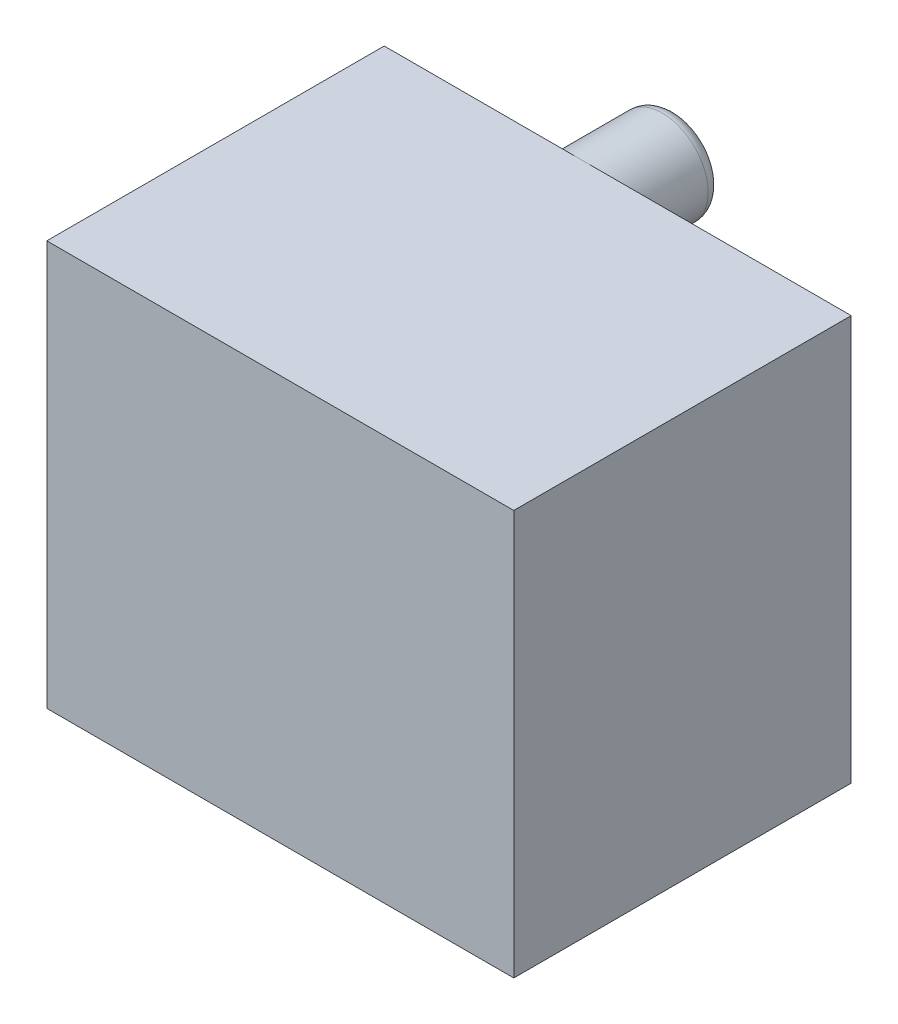
ISO-10303-21;
HEADER;
FILE_DESCRIPTION(('STEP AP214'),'2;1');
FILE_NAME('part.step','',(''),(''),'','','');
FILE_SCHEMA(('AUTOMOTIVE_DESIGN { 1 0 10303 214 1 1 1 1 }'));
ENDSEC;
DATA;
#1=APPLICATION_CONTEXT('core data for automotive mechanical design processes');
#2=APPLICATION_PROTOCOL_DEFINITION('international standard','automotive_design',2000,#1);
#3=PRODUCT_CONTEXT('',#1,'mechanical');
#4=PRODUCT('Part','Part','',(#3));
#5=PRODUCT_RELATED_PRODUCT_CATEGORY('part','',(#4));
#6=PRODUCT_DEFINITION_FORMATION('','',#4);
#7=PRODUCT_DEFINITION_CONTEXT('part definition',#1,'design');
#8=PRODUCT_DEFINITION('design','',#6,#7);
#9=PRODUCT_DEFINITION_SHAPE('','',#8);
#10=(LENGTH_UNIT() NAMED_UNIT(*) SI_UNIT(.MILLI.,.METRE.));
#11=(NAMED_UNIT(*) PLANE_ANGLE_UNIT() SI_UNIT($,.RADIAN.));
#12=(NAMED_UNIT(*) SI_UNIT($,.STERADIAN.) SOLID_ANGLE_UNIT());
#13=UNCERTAINTY_MEASURE_WITH_UNIT(LENGTH_MEASURE(1.E-05),#10,'distance_accuracy_value','');
#14=(GEOMETRIC_REPRESENTATION_CONTEXT(3) GLOBAL_UNCERTAINTY_ASSIGNED_CONTEXT((#13)) GLOBAL_UNIT_ASSIGNED_CONTEXT((#10,
#11,#12)) REPRESENTATION_CONTEXT('',''));
#15=CARTESIAN_POINT('',(0.,0.,0.));
#16=DIRECTION('',(0.,0.,1.));
#17=DIRECTION('',(1.,0.,0.));
#18=AXIS2_PLACEMENT_3D('',#15,#16,#17);
#19=CARTESIAN_POINT('',(8.65,7.5,12.5));
#20=DIRECTION('',(-1.,0.,0.));
#21=DIRECTION('',(0.,-1.,0.));
#22=AXIS2_PLACEMENT_3D('',#19,#20,#21);
#23=PLANE('',#22);
#24=DIRECTION('',(0.,1.,0.));
#25=VECTOR('',#24,1.);
#26=CARTESIAN_POINT('',(8.65,7.5,0.));
#27=LINE('',#26,#25);
#28=CARTESIAN_POINT('',(8.65,-7.5,0.));
#29=VERTEX_POINT('',#28);
#30=CARTESIAN_POINT('',(8.65,7.5,0.));
#31=VERTEX_POINT('',#30);
#32=EDGE_CURVE('E224',#29,#31,#27,.T.);
#33=ORIENTED_EDGE('',*,*,#32,.T.);
#34=DIRECTION('',(0.,0.,-1.));
#35=VECTOR('',#34,1.);
#36=CARTESIAN_POINT('',(8.65,7.5,12.5));
#37=LINE('',#36,#35);
#38=CARTESIAN_POINT('',(8.65,7.5,12.5));
#39=VERTEX_POINT('',#38);
#40=EDGE_CURVE('E236',#39,#31,#37,.T.);
#41=ORIENTED_EDGE('',*,*,#40,.F.);
#42=DIRECTION('',(0.,1.,0.));
#43=VECTOR('',#42,1.);
#44=CARTESIAN_POINT('',(8.65,7.5,12.5));
#45=LINE('',#44,#43);
#46=CARTESIAN_POINT('',(8.65,-7.5,12.5));
#47=VERTEX_POINT('',#46);
#48=EDGE_CURVE('E217',#47,#39,#45,.T.);
#49=ORIENTED_EDGE('',*,*,#48,.F.);
#50=DIRECTION('',(0.,0.,-1.));
#51=VECTOR('',#50,1.);
#52=CARTESIAN_POINT('',(8.65,-7.5,12.5));
#53=LINE('',#52,#51);
#54=EDGE_CURVE('E230',#47,#29,#53,.T.);
#55=ORIENTED_EDGE('',*,*,#54,.T.);
#56=EDGE_LOOP('',(#33,#41,#49,#55));
#57=FACE_BOUND('',#56,.T.);
#58=ADVANCED_FACE('F34',(#57),#23,.F.);
#59=CARTESIAN_POINT('',(-8.65,7.5,12.5));
#60=DIRECTION('',(0.,-1.,0.));
#61=DIRECTION('',(0.,0.,-1.));
#62=AXIS2_PLACEMENT_3D('',#59,#60,#61);
#63=PLANE('',#62);
#64=DIRECTION('',(-1.,0.,0.));
#65=VECTOR('',#64,1.);
#66=CARTESIAN_POINT('',(-8.65,7.5,0.));
#67=LINE('',#66,#65);
#68=CARTESIAN_POINT('',(-1.35,7.5,0.));
#69=VERTEX_POINT('',#68);
#70=EDGE_CURVE('E226',#31,#69,#67,.T.);
#71=ORIENTED_EDGE('',*,*,#70,.T.);
#72=CARTESIAN_POINT('',(-8.65,7.5,0.));
#73=VERTEX_POINT('',#72);
#74=EDGE_CURVE('E527',#69,#73,#67,.T.);
#75=ORIENTED_EDGE('',*,*,#74,.T.);
#76=DIRECTION('',(0.,0.,-1.));
#77=VECTOR('',#76,1.);
#78=CARTESIAN_POINT('',(-8.65,7.5,12.5));
#79=LINE('',#78,#77);
#80=CARTESIAN_POINT('',(-8.65,7.5,12.5));
#81=VERTEX_POINT('',#80);
#82=EDGE_CURVE('E233',#81,#73,#79,.T.);
#83=ORIENTED_EDGE('',*,*,#82,.F.);
#84=DIRECTION('',(-1.,0.,0.));
#85=VECTOR('',#84,1.);
#86=CARTESIAN_POINT('',(-8.65,7.5,12.5));
#87=LINE('',#86,#85);
#88=EDGE_CURVE('E87',#39,#81,#87,.T.);
#89=ORIENTED_EDGE('',*,*,#88,.F.);
#90=ORIENTED_EDGE('',*,*,#40,.T.);
#91=EDGE_LOOP('',(#71,#75,#83,#89,#90));
#92=FACE_BOUND('',#91,.T.);
#93=ADVANCED_FACE('F259',(#92),#63,.F.);
#94=CARTESIAN_POINT('',(-8.65,7.5,12.5));
#95=DIRECTION('',(1.,0.,0.));
#96=DIRECTION('',(0.,1.,0.));
#97=AXIS2_PLACEMENT_3D('',#94,#95,#96);
#98=PLANE('',#97);
#99=DIRECTION('',(0.,1.,0.));
#100=VECTOR('',#99,1.);
#101=CARTESIAN_POINT('',(-8.65,5.,10.5));
#102=LINE('',#101,#100);
#103=CARTESIAN_POINT('',(-8.65,-5.,10.5));
#104=VERTEX_POINT('',#103);
#105=CARTESIAN_POINT('',(-8.65,5.,10.5));
#106=VERTEX_POINT('',#105);
#107=EDGE_CURVE('E425',#104,#106,#102,.T.);
#108=ORIENTED_EDGE('',*,*,#107,.F.);
#109=DIRECTION('',(0.,0.,1.));
#110=VECTOR('',#109,1.);
#111=CARTESIAN_POINT('',(-8.65,-5.,10.5));
#112=LINE('',#111,#110);
#113=CARTESIAN_POINT('',(-8.65,-5.,8.5));
#114=VERTEX_POINT('',#113);
#115=EDGE_CURVE('E49',#114,#104,#112,.T.);
#116=ORIENTED_EDGE('',*,*,#115,.F.);
#117=DIRECTION('',(0.,1.,0.));
#118=VECTOR('',#117,1.);
#119=CARTESIAN_POINT('',(-8.65,-5.,8.5));
#120=LINE('',#119,#118);
#121=CARTESIAN_POINT('',(-8.65,-5.7,8.5));
#122=VERTEX_POINT('',#121);
#123=EDGE_CURVE('E479',#122,#114,#120,.T.);
#124=ORIENTED_EDGE('',*,*,#123,.F.);
#125=DIRECTION('',(0.,0.,1.));
#126=VECTOR('',#125,1.);
#127=CARTESIAN_POINT('',(-8.65,-5.7,8.5));
#128=LINE('',#127,#126);
#129=CARTESIAN_POINT('',(-8.65,-5.7,5.6));
#130=VERTEX_POINT('',#129);
#131=EDGE_CURVE('E476',#130,#122,#128,.T.);
#132=ORIENTED_EDGE('',*,*,#131,.F.);
#133=DIRECTION('',(0.,-1.,0.));
#134=VECTOR('',#133,1.);
#135=CARTESIAN_POINT('',(-8.65,-5.7,5.6));
#136=LINE('',#135,#134);
#137=CARTESIAN_POINT('',(-8.65,-5.,5.6));
#138=VERTEX_POINT('',#137);
#139=EDGE_CURVE('E473',#138,#130,#136,.T.);
#140=ORIENTED_EDGE('',*,*,#139,.F.);
#141=DIRECTION('',(0.,0.,1.));
#142=VECTOR('',#141,1.);
#143=CARTESIAN_POINT('',(-8.65,-5.,5.6));
#144=LINE('',#143,#142);
#145=CARTESIAN_POINT('',(-8.65,-5.,3.3));
#146=VERTEX_POINT('',#145);
#147=EDGE_CURVE('E470',#146,#138,#144,.T.);
#148=ORIENTED_EDGE('',*,*,#147,.F.);
#149=DIRECTION('',(0.,-1.,0.));
#150=VECTOR('',#149,1.);
#151=CARTESIAN_POINT('',(-8.65,-5.,3.3));
#152=LINE('',#151,#150);
#153=CARTESIAN_POINT('',(-8.65,-3.5,3.3));
#154=VERTEX_POINT('',#153);
#155=EDGE_CURVE('E467',#154,#146,#152,.T.);
#156=ORIENTED_EDGE('',*,*,#155,.F.);
#157=DIRECTION('',(0.,0.,1.));
#158=VECTOR('',#157,1.);
#159=CARTESIAN_POINT('',(-8.65,-3.5,3.3));
#160=LINE('',#159,#158);
#161=CARTESIAN_POINT('',(-8.65,-3.5,2.));
#162=VERTEX_POINT('',#161);
#163=EDGE_CURVE('E464',#162,#154,#160,.T.);
#164=ORIENTED_EDGE('',*,*,#163,.F.);
#165=DIRECTION('',(0.,-1.,0.));
#166=VECTOR('',#165,1.);
#167=CARTESIAN_POINT('',(-8.65,-3.5,2.));
#168=LINE('',#167,#166);
#169=CARTESIAN_POINT('',(-8.65,-2.,2.));
#170=VERTEX_POINT('',#169);
#171=EDGE_CURVE('E461',#170,#162,#168,.T.);
#172=ORIENTED_EDGE('',*,*,#171,.F.);
#173=DIRECTION('',(0.,0.,1.));
#174=VECTOR('',#173,1.);
#175=CARTESIAN_POINT('',(-8.65,-2.,2.));
#176=LINE('',#175,#174);
#177=CARTESIAN_POINT('',(-8.65,-2.,1.));
#178=VERTEX_POINT('',#177);
#179=EDGE_CURVE('E458',#178,#170,#176,.T.);
#180=ORIENTED_EDGE('',*,*,#179,.F.);
#181=DIRECTION('',(0.,-1.,0.));
#182=VECTOR('',#181,1.);
#183=CARTESIAN_POINT('',(-8.65,-2.,1.));
#184=LINE('',#183,#182);
#185=CARTESIAN_POINT('',(-8.65,2.,1.));
#186=VERTEX_POINT('',#185);
#187=EDGE_CURVE('E455',#186,#178,#184,.T.);
#188=ORIENTED_EDGE('',*,*,#187,.F.);
#189=DIRECTION('',(0.,0.,-1.));
#190=VECTOR('',#189,1.);
#191=CARTESIAN_POINT('',(-8.65,2.,2.));
#192=LINE('',#191,#190);
#193=CARTESIAN_POINT('',(-8.65,2.,2.));
#194=VERTEX_POINT('',#193);
#195=EDGE_CURVE('E452',#194,#186,#192,.T.);
#196=ORIENTED_EDGE('',*,*,#195,.F.);
#197=DIRECTION('',(0.,-1.,0.));
#198=VECTOR('',#197,1.);
#199=CARTESIAN_POINT('',(-8.65,3.5,2.));
#200=LINE('',#199,#198);
#201=CARTESIAN_POINT('',(-8.65,3.5,2.));
#202=VERTEX_POINT('',#201);
#203=EDGE_CURVE('E449',#202,#194,#200,.T.);
#204=ORIENTED_EDGE('',*,*,#203,.F.);
#205=DIRECTION('',(0.,0.,-1.));
#206=VECTOR('',#205,1.);
#207=CARTESIAN_POINT('',(-8.65,3.5,3.3));
#208=LINE('',#207,#206);
#209=CARTESIAN_POINT('',(-8.65,3.5,3.3));
#210=VERTEX_POINT('',#209);
#211=EDGE_CURVE('E446',#210,#202,#208,.T.);
#212=ORIENTED_EDGE('',*,*,#211,.F.);
#213=DIRECTION('',(0.,-1.,0.));
#214=VECTOR('',#213,1.);
#215=CARTESIAN_POINT('',(-8.65,5.,3.3));
#216=LINE('',#215,#214);
#217=CARTESIAN_POINT('',(-8.65,5.,3.3));
#218=VERTEX_POINT('',#217);
#219=EDGE_CURVE('E443',#218,#210,#216,.T.);
#220=ORIENTED_EDGE('',*,*,#219,.F.);
#221=DIRECTION('',(0.,0.,-1.));
#222=VECTOR('',#221,1.);
#223=CARTESIAN_POINT('',(-8.65,5.,5.6));
#224=LINE('',#223,#222);
#225=CARTESIAN_POINT('',(-8.65,5.,5.6));
#226=VERTEX_POINT('',#225);
#227=EDGE_CURVE('E440',#226,#218,#224,.T.);
#228=ORIENTED_EDGE('',*,*,#227,.F.);
#229=DIRECTION('',(0.,-1.,0.));
#230=VECTOR('',#229,1.);
#231=CARTESIAN_POINT('',(-8.65,5.7,5.6));
#232=LINE('',#231,#230);
#233=CARTESIAN_POINT('',(-8.65,5.7,5.6));
#234=VERTEX_POINT('',#233);
#235=EDGE_CURVE('E437',#234,#226,#232,.T.);
#236=ORIENTED_EDGE('',*,*,#235,.F.);
#237=DIRECTION('',(0.,0.,-1.));
#238=VECTOR('',#237,1.);
#239=CARTESIAN_POINT('',(-8.65,5.7,8.5));
#240=LINE('',#239,#238);
#241=CARTESIAN_POINT('',(-8.65,5.7,8.5));
#242=VERTEX_POINT('',#241);
#243=EDGE_CURVE('E434',#242,#234,#240,.T.);
#244=ORIENTED_EDGE('',*,*,#243,.F.);
#245=DIRECTION('',(0.,1.,0.));
#246=VECTOR('',#245,1.);
#247=CARTESIAN_POINT('',(-8.65,5.,8.5));
#248=LINE('',#247,#246);
#249=CARTESIAN_POINT('',(-8.65,5.,8.5));
#250=VERTEX_POINT('',#249);
#251=EDGE_CURVE('E431',#250,#242,#248,.T.);
#252=ORIENTED_EDGE('',*,*,#251,.F.);
#253=DIRECTION('',(0.,0.,-1.));
#254=VECTOR('',#253,1.);
#255=CARTESIAN_POINT('',(-8.65,5.,10.5));
#256=LINE('',#255,#254);
#257=EDGE_CURVE('E428',#106,#250,#256,.T.);
#258=ORIENTED_EDGE('',*,*,#257,.F.);
#259=EDGE_LOOP('',(#108,#116,#124,#132,#140,#148,#156,#164,#172,#180,#188,#196,#204,#212,#220,
#228,#236,#244,#252,#258));
#260=FACE_BOUND('',#259,.T.);
#261=DIRECTION('',(0.,-1.,0.));
#262=VECTOR('',#261,1.);
#263=CARTESIAN_POINT('',(-8.65,7.5,0.));
#264=LINE('',#263,#262);
#265=CARTESIAN_POINT('',(-8.65,-7.5,0.));
#266=VERTEX_POINT('',#265);
#267=EDGE_CURVE('E225',#73,#266,#264,.T.);
#268=ORIENTED_EDGE('',*,*,#267,.T.);
#269=DIRECTION('',(0.,0.,-1.));
#270=VECTOR('',#269,1.);
#271=CARTESIAN_POINT('',(-8.65,-7.5,12.5));
#272=LINE('',#271,#270);
#273=CARTESIAN_POINT('',(-8.65,-7.5,12.5));
#274=VERTEX_POINT('',#273);
#275=EDGE_CURVE('E213',#274,#266,#272,.T.);
#276=ORIENTED_EDGE('',*,*,#275,.F.);
#277=DIRECTION('',(0.,-1.,0.));
#278=VECTOR('',#277,1.);
#279=CARTESIAN_POINT('',(-8.65,7.5,12.5));
#280=LINE('',#279,#278);
#281=EDGE_CURVE('E524',#81,#274,#280,.T.);
#282=ORIENTED_EDGE('',*,*,#281,.F.);
#283=ORIENTED_EDGE('',*,*,#82,.T.);
#284=EDGE_LOOP('',(#268,#276,#282,#283));
#285=FACE_BOUND('',#284,.T.);
#286=ADVANCED_FACE('F265',(#260,#285),#98,.F.);
#287=CARTESIAN_POINT('',(-8.65,-7.5,12.5));
#288=DIRECTION('',(0.,1.,0.));
#289=DIRECTION('',(0.,0.,1.));
#290=AXIS2_PLACEMENT_3D('',#287,#288,#289);
#291=PLANE('',#290);
#292=DIRECTION('',(1.,0.,0.));
#293=VECTOR('',#292,1.);
#294=CARTESIAN_POINT('',(-8.65,-7.5,0.));
#295=LINE('',#294,#293);
#296=CARTESIAN_POINT('',(-1.35,-7.5,0.));
#297=VERTEX_POINT('',#296);
#298=EDGE_CURVE('E210',#266,#297,#295,.T.);
#299=ORIENTED_EDGE('',*,*,#298,.T.);
#300=EDGE_CURVE('E79',#297,#29,#295,.T.);
#301=ORIENTED_EDGE('',*,*,#300,.T.);
#302=ORIENTED_EDGE('',*,*,#54,.F.);
#303=DIRECTION('',(1.,0.,0.));
#304=VECTOR('',#303,1.);
#305=CARTESIAN_POINT('',(-8.65,-7.5,12.5));
#306=LINE('',#305,#304);
#307=EDGE_CURVE('E58',#274,#47,#306,.T.);
#308=ORIENTED_EDGE('',*,*,#307,.F.);
#309=ORIENTED_EDGE('',*,*,#275,.T.);
#310=EDGE_LOOP('',(#299,#301,#302,#308,#309));
#311=FACE_BOUND('',#310,.T.);
#312=ADVANCED_FACE('F211',(#311),#291,.F.);
#313=CARTESIAN_POINT('',(0.,0.,12.5));
#314=DIRECTION('',(0.,0.,1.));
#315=DIRECTION('',(1.,0.,0.));
#316=AXIS2_PLACEMENT_3D('',#313,#314,#315);
#317=PLANE('',#316);
#318=ORIENTED_EDGE('',*,*,#48,.T.);
#319=ORIENTED_EDGE('',*,*,#88,.T.);
#320=ORIENTED_EDGE('',*,*,#281,.T.);
#321=ORIENTED_EDGE('',*,*,#307,.T.);
#322=EDGE_LOOP('',(#318,#319,#320,#321));
#323=FACE_BOUND('',#322,.T.);
#324=ADVANCED_FACE('F273',(#323),#317,.T.);
#325=CARTESIAN_POINT('',(0.,0.,0.));
#326=DIRECTION('',(0.,0.,1.));
#327=DIRECTION('',(1.,0.,0.));
#328=AXIS2_PLACEMENT_3D('',#325,#326,#327);
#329=PLANE('',#328);
#330=ORIENTED_EDGE('',*,*,#300,.F.);
#331=CARTESIAN_POINT('',(-1.35,-5.8,0.));
#332=DIRECTION('',(0.,0.,-1.));
#333=DIRECTION('',(1.,0.,0.));
#334=AXIS2_PLACEMENT_3D('',#331,#332,#333);
#335=CIRCLE('',#334,1.7);
#336=EDGE_CURVE('E222',#297,#297,#335,.T.);
#337=ORIENTED_EDGE('',*,*,#336,.F.);
#338=ORIENTED_EDGE('',*,*,#298,.F.);
#339=ORIENTED_EDGE('',*,*,#267,.F.);
#340=ORIENTED_EDGE('',*,*,#74,.F.);
#341=CARTESIAN_POINT('',(-1.35,5.8,0.));
#342=DIRECTION('',(0.,0.,-1.));
#343=DIRECTION('',(-1.,0.,0.));
#344=AXIS2_PLACEMENT_3D('',#341,#342,#343);
#345=CIRCLE('',#344,1.7);
#346=EDGE_CURVE('E379',#69,#69,#345,.T.);
#347=ORIENTED_EDGE('',*,*,#346,.F.);
#348=ORIENTED_EDGE('',*,*,#70,.F.);
#349=ORIENTED_EDGE('',*,*,#32,.F.);
#350=EDGE_LOOP('',(#330,#337,#338,#339,#340,#347,#348,#349));
#351=FACE_BOUND('',#350,.T.);
#352=ADVANCED_FACE('F220',(#351),#329,.F.);
#353=CARTESIAN_POINT('',(23.4894743842226,-5.,10.5));
#354=DIRECTION('',(0.,-1.,0.));
#355=DIRECTION('',(1.,0.,0.));
#356=AXIS2_PLACEMENT_3D('',#353,#354,#355);
#357=PLANE('',#356);
#358=DIRECTION('',(0.,0.,-1.));
#359=VECTOR('',#358,1.);
#360=CARTESIAN_POINT('',(6.65,-5.,10.5));
#361=LINE('',#360,#359);
#362=CARTESIAN_POINT('',(6.65,-5.,10.5));
#363=VERTEX_POINT('',#362);
#364=CARTESIAN_POINT('',(6.65,-5.,8.5));
#365=VERTEX_POINT('',#364);
#366=EDGE_CURVE('E421',#363,#365,#361,.T.);
#367=ORIENTED_EDGE('',*,*,#366,.T.);
#368=DIRECTION('',(-1.,0.,0.));
#369=VECTOR('',#368,1.);
#370=CARTESIAN_POINT('',(23.4894743842226,-5.,8.5));
#371=LINE('',#370,#369);
#372=EDGE_CURVE('E387',#365,#114,#371,.T.);
#373=ORIENTED_EDGE('',*,*,#372,.T.);
#374=ORIENTED_EDGE('',*,*,#115,.T.);
#375=DIRECTION('',(-1.,0.,0.));
#376=VECTOR('',#375,1.);
#377=CARTESIAN_POINT('',(23.4894743842226,-5.,10.5));
#378=LINE('',#377,#376);
#379=EDGE_CURVE('E482',#363,#104,#378,.T.);
#380=ORIENTED_EDGE('',*,*,#379,.F.);
#381=EDGE_LOOP('',(#367,#373,#374,#380));
#382=FACE_BOUND('',#381,.T.);
#383=ADVANCED_FACE('F276',(#382),#357,.F.);
#384=CARTESIAN_POINT('',(23.4894743842226,-5.,8.5));
#385=DIRECTION('',(0.,0.,1.));
#386=DIRECTION('',(1.,0.,0.));
#387=AXIS2_PLACEMENT_3D('',#384,#385,#386);
#388=PLANE('',#387);
#389=DIRECTION('',(0.,-1.,0.));
#390=VECTOR('',#389,1.);
#391=CARTESIAN_POINT('',(6.65,-5.,8.5));
#392=LINE('',#391,#390);
#393=CARTESIAN_POINT('',(6.65,-5.7,8.5));
#394=VERTEX_POINT('',#393);
#395=EDGE_CURVE('E419',#365,#394,#392,.T.);
#396=ORIENTED_EDGE('',*,*,#395,.T.);
#397=DIRECTION('',(-1.,0.,0.));
#398=VECTOR('',#397,1.);
#399=CARTESIAN_POINT('',(23.4894743842226,-5.7,8.5));
#400=LINE('',#399,#398);
#401=EDGE_CURVE('E484',#394,#122,#400,.T.);
#402=ORIENTED_EDGE('',*,*,#401,.T.);
#403=ORIENTED_EDGE('',*,*,#123,.T.);
#404=ORIENTED_EDGE('',*,*,#372,.F.);
#405=EDGE_LOOP('',(#396,#402,#403,#404));
#406=FACE_BOUND('',#405,.T.);
#407=ADVANCED_FACE('F281',(#406),#388,.F.);
#408=CARTESIAN_POINT('',(23.4894743842226,-5.7,8.5));
#409=DIRECTION('',(0.,-1.,0.));
#410=DIRECTION('',(1.,0.,0.));
#411=AXIS2_PLACEMENT_3D('',#408,#409,#410);
#412=PLANE('',#411);
#413=DIRECTION('',(0.,0.,-1.));
#414=VECTOR('',#413,1.);
#415=CARTESIAN_POINT('',(6.65,-5.7,8.5));
#416=LINE('',#415,#414);
#417=CARTESIAN_POINT('',(6.65,-5.7,5.6));
#418=VERTEX_POINT('',#417);
#419=EDGE_CURVE('E417',#394,#418,#416,.T.);
#420=ORIENTED_EDGE('',*,*,#419,.T.);
#421=DIRECTION('',(-1.,0.,0.));
#422=VECTOR('',#421,1.);
#423=CARTESIAN_POINT('',(23.4894743842226,-5.7,5.6));
#424=LINE('',#423,#422);
#425=EDGE_CURVE('E486',#418,#130,#424,.T.);
#426=ORIENTED_EDGE('',*,*,#425,.T.);
#427=ORIENTED_EDGE('',*,*,#131,.T.);
#428=ORIENTED_EDGE('',*,*,#401,.F.);
#429=EDGE_LOOP('',(#420,#426,#427,#428));
#430=FACE_BOUND('',#429,.T.);
#431=ADVANCED_FACE('F350',(#430),#412,.F.);
#432=CARTESIAN_POINT('',(23.4894743842226,-5.7,5.6));
#433=DIRECTION('',(0.,0.,-1.));
#434=DIRECTION('',(-1.,0.,0.));
#435=AXIS2_PLACEMENT_3D('',#432,#433,#434);
#436=PLANE('',#435);
#437=DIRECTION('',(0.,1.,0.));
#438=VECTOR('',#437,1.);
#439=CARTESIAN_POINT('',(6.65,-5.7,5.6));
#440=LINE('',#439,#438);
#441=CARTESIAN_POINT('',(6.65,-5.,5.6));
#442=VERTEX_POINT('',#441);
#443=EDGE_CURVE('E415',#418,#442,#440,.T.);
#444=ORIENTED_EDGE('',*,*,#443,.T.);
#445=DIRECTION('',(-1.,0.,0.));
#446=VECTOR('',#445,1.);
#447=CARTESIAN_POINT('',(23.4894743842226,-5.,5.6));
#448=LINE('',#447,#446);
#449=EDGE_CURVE('E488',#442,#138,#448,.T.);
#450=ORIENTED_EDGE('',*,*,#449,.T.);
#451=ORIENTED_EDGE('',*,*,#139,.T.);
#452=ORIENTED_EDGE('',*,*,#425,.F.);
#453=EDGE_LOOP('',(#444,#450,#451,#452));
#454=FACE_BOUND('',#453,.T.);
#455=ADVANCED_FACE('F346',(#454),#436,.F.);
#456=CARTESIAN_POINT('',(23.4894743842226,-5.,5.6));
#457=DIRECTION('',(0.,-1.,0.));
#458=DIRECTION('',(1.,0.,0.));
#459=AXIS2_PLACEMENT_3D('',#456,#457,#458);
#460=PLANE('',#459);
#461=DIRECTION('',(0.,0.,-1.));
#462=VECTOR('',#461,1.);
#463=CARTESIAN_POINT('',(6.65,-5.,5.6));
#464=LINE('',#463,#462);
#465=CARTESIAN_POINT('',(6.65,-5.,3.3));
#466=VERTEX_POINT('',#465);
#467=EDGE_CURVE('E413',#442,#466,#464,.T.);
#468=ORIENTED_EDGE('',*,*,#467,.T.);
#469=DIRECTION('',(-1.,0.,0.));
#470=VECTOR('',#469,1.);
#471=CARTESIAN_POINT('',(23.4894743842226,-5.,3.3));
#472=LINE('',#471,#470);
#473=EDGE_CURVE('E490',#466,#146,#472,.T.);
#474=ORIENTED_EDGE('',*,*,#473,.T.);
#475=ORIENTED_EDGE('',*,*,#147,.T.);
#476=ORIENTED_EDGE('',*,*,#449,.F.);
#477=EDGE_LOOP('',(#468,#474,#475,#476));
#478=FACE_BOUND('',#477,.T.);
#479=ADVANCED_FACE('F342',(#478),#460,.F.);
#480=CARTESIAN_POINT('',(23.4894743842226,-5.,3.3));
#481=DIRECTION('',(0.,0.,-1.));
#482=DIRECTION('',(-1.,0.,0.));
#483=AXIS2_PLACEMENT_3D('',#480,#481,#482);
#484=PLANE('',#483);
#485=DIRECTION('',(0.,1.,0.));
#486=VECTOR('',#485,1.);
#487=CARTESIAN_POINT('',(6.65,-5.,3.3));
#488=LINE('',#487,#486);
#489=CARTESIAN_POINT('',(6.65,-3.5,3.3));
#490=VERTEX_POINT('',#489);
#491=EDGE_CURVE('E411',#466,#490,#488,.T.);
#492=ORIENTED_EDGE('',*,*,#491,.T.);
#493=DIRECTION('',(-1.,0.,0.));
#494=VECTOR('',#493,1.);
#495=CARTESIAN_POINT('',(23.4894743842226,-3.5,3.3));
#496=LINE('',#495,#494);
#497=EDGE_CURVE('E492',#490,#154,#496,.T.);
#498=ORIENTED_EDGE('',*,*,#497,.T.);
#499=ORIENTED_EDGE('',*,*,#155,.T.);
#500=ORIENTED_EDGE('',*,*,#473,.F.);
#501=EDGE_LOOP('',(#492,#498,#499,#500));
#502=FACE_BOUND('',#501,.T.);
#503=ADVANCED_FACE('F338',(#502),#484,.F.);
#504=CARTESIAN_POINT('',(23.4894743842226,-3.5,3.3));
#505=DIRECTION('',(0.,-1.,0.));
#506=DIRECTION('',(0.,0.,-1.));
#507=AXIS2_PLACEMENT_3D('',#504,#505,#506);
#508=PLANE('',#507);
#509=DIRECTION('',(0.,0.,-1.));
#510=VECTOR('',#509,1.);
#511=CARTESIAN_POINT('',(6.65,-3.5,3.3));
#512=LINE('',#511,#510);
#513=CARTESIAN_POINT('',(6.65,-3.5,2.));
#514=VERTEX_POINT('',#513);
#515=EDGE_CURVE('E409',#490,#514,#512,.T.);
#516=ORIENTED_EDGE('',*,*,#515,.T.);
#517=DIRECTION('',(-1.,0.,0.));
#518=VECTOR('',#517,1.);
#519=CARTESIAN_POINT('',(23.4894743842226,-3.5,2.));
#520=LINE('',#519,#518);
#521=EDGE_CURVE('E494',#514,#162,#520,.T.);
#522=ORIENTED_EDGE('',*,*,#521,.T.);
#523=ORIENTED_EDGE('',*,*,#163,.T.);
#524=ORIENTED_EDGE('',*,*,#497,.F.);
#525=EDGE_LOOP('',(#516,#522,#523,#524));
#526=FACE_BOUND('',#525,.T.);
#527=ADVANCED_FACE('F334',(#526),#508,.F.);
#528=CARTESIAN_POINT('',(23.4894743842226,-3.5,2.));
#529=DIRECTION('',(0.,0.,-1.));
#530=DIRECTION('',(0.,1.,0.));
#531=AXIS2_PLACEMENT_3D('',#528,#529,#530);
#532=PLANE('',#531);
#533=DIRECTION('',(0.,1.,0.));
#534=VECTOR('',#533,1.);
#535=CARTESIAN_POINT('',(6.65,-3.5,2.));
#536=LINE('',#535,#534);
#537=CARTESIAN_POINT('',(6.65,-2.,2.));
#538=VERTEX_POINT('',#537);
#539=EDGE_CURVE('E407',#514,#538,#536,.T.);
#540=ORIENTED_EDGE('',*,*,#539,.T.);
#541=DIRECTION('',(-1.,0.,0.));
#542=VECTOR('',#541,1.);
#543=CARTESIAN_POINT('',(23.4894743842226,-2.,2.));
#544=LINE('',#543,#542);
#545=EDGE_CURVE('E496',#538,#170,#544,.T.);
#546=ORIENTED_EDGE('',*,*,#545,.T.);
#547=ORIENTED_EDGE('',*,*,#171,.T.);
#548=ORIENTED_EDGE('',*,*,#521,.F.);
#549=EDGE_LOOP('',(#540,#546,#547,#548));
#550=FACE_BOUND('',#549,.T.);
#551=ADVANCED_FACE('F330',(#550),#532,.F.);
#552=CARTESIAN_POINT('',(23.4894743842226,-2.,2.));
#553=DIRECTION('',(0.,-1.,0.));
#554=DIRECTION('',(1.,0.,0.));
#555=AXIS2_PLACEMENT_3D('',#552,#553,#554);
#556=PLANE('',#555);
#557=DIRECTION('',(0.,0.,-1.));
#558=VECTOR('',#557,1.);
#559=CARTESIAN_POINT('',(6.65,-2.,2.));
#560=LINE('',#559,#558);
#561=CARTESIAN_POINT('',(6.65,-2.,1.));
#562=VERTEX_POINT('',#561);
#563=EDGE_CURVE('E405',#538,#562,#560,.T.);
#564=ORIENTED_EDGE('',*,*,#563,.T.);
#565=DIRECTION('',(-1.,0.,0.));
#566=VECTOR('',#565,1.);
#567=CARTESIAN_POINT('',(23.4894743842226,-2.,1.));
#568=LINE('',#567,#566);
#569=EDGE_CURVE('E498',#562,#178,#568,.T.);
#570=ORIENTED_EDGE('',*,*,#569,.T.);
#571=ORIENTED_EDGE('',*,*,#179,.T.);
#572=ORIENTED_EDGE('',*,*,#545,.F.);
#573=EDGE_LOOP('',(#564,#570,#571,#572));
#574=FACE_BOUND('',#573,.T.);
#575=ADVANCED_FACE('F326',(#574),#556,.F.);
#576=CARTESIAN_POINT('',(23.4894743842226,-2.,1.));
#577=DIRECTION('',(0.,0.,-1.));
#578=DIRECTION('',(-1.,0.,0.));
#579=AXIS2_PLACEMENT_3D('',#576,#577,#578);
#580=PLANE('',#579);
#581=DIRECTION('',(0.,1.,0.));
#582=VECTOR('',#581,1.);
#583=CARTESIAN_POINT('',(6.65,-2.,1.));
#584=LINE('',#583,#582);
#585=CARTESIAN_POINT('',(6.65,2.,1.));
#586=VERTEX_POINT('',#585);
#587=EDGE_CURVE('E403',#562,#586,#584,.T.);
#588=ORIENTED_EDGE('',*,*,#587,.T.);
#589=DIRECTION('',(-1.,0.,0.));
#590=VECTOR('',#589,1.);
#591=CARTESIAN_POINT('',(23.4894743842226,2.,1.));
#592=LINE('',#591,#590);
#593=EDGE_CURVE('E500',#586,#186,#592,.T.);
#594=ORIENTED_EDGE('',*,*,#593,.T.);
#595=ORIENTED_EDGE('',*,*,#187,.T.);
#596=ORIENTED_EDGE('',*,*,#569,.F.);
#597=EDGE_LOOP('',(#588,#594,#595,#596));
#598=FACE_BOUND('',#597,.T.);
#599=ADVANCED_FACE('F322',(#598),#580,.F.);
#600=CARTESIAN_POINT('',(23.4894743842226,2.,2.));
#601=DIRECTION('',(0.,1.,0.));
#602=DIRECTION('',(-1.,0.,0.));
#603=AXIS2_PLACEMENT_3D('',#600,#601,#602);
#604=PLANE('',#603);
#605=DIRECTION('',(0.,0.,1.));
#606=VECTOR('',#605,1.);
#607=CARTESIAN_POINT('',(6.65,2.,2.));
#608=LINE('',#607,#606);
#609=CARTESIAN_POINT('',(6.65,2.,2.));
#610=VERTEX_POINT('',#609);
#611=EDGE_CURVE('E401',#586,#610,#608,.T.);
#612=ORIENTED_EDGE('',*,*,#611,.T.);
#613=DIRECTION('',(-1.,0.,0.));
#614=VECTOR('',#613,1.);
#615=CARTESIAN_POINT('',(23.4894743842226,2.,2.));
#616=LINE('',#615,#614);
#617=EDGE_CURVE('E502',#610,#194,#616,.T.);
#618=ORIENTED_EDGE('',*,*,#617,.T.);
#619=ORIENTED_EDGE('',*,*,#195,.T.);
#620=ORIENTED_EDGE('',*,*,#593,.F.);
#621=EDGE_LOOP('',(#612,#618,#619,#620));
#622=FACE_BOUND('',#621,.T.);
#623=ADVANCED_FACE('F318',(#622),#604,.F.);
#624=CARTESIAN_POINT('',(23.4894743842226,3.5,2.));
#625=DIRECTION('',(0.,0.,-1.));
#626=DIRECTION('',(0.,1.,0.));
#627=AXIS2_PLACEMENT_3D('',#624,#625,#626);
#628=PLANE('',#627);
#629=DIRECTION('',(0.,1.,0.));
#630=VECTOR('',#629,1.);
#631=CARTESIAN_POINT('',(6.65,3.5,2.));
#632=LINE('',#631,#630);
#633=CARTESIAN_POINT('',(6.65,3.5,2.));
#634=VERTEX_POINT('',#633);
#635=EDGE_CURVE('E399',#610,#634,#632,.T.);
#636=ORIENTED_EDGE('',*,*,#635,.T.);
#637=DIRECTION('',(-1.,0.,0.));
#638=VECTOR('',#637,1.);
#639=CARTESIAN_POINT('',(23.4894743842226,3.5,2.));
#640=LINE('',#639,#638);
#641=EDGE_CURVE('E504',#634,#202,#640,.T.);
#642=ORIENTED_EDGE('',*,*,#641,.T.);
#643=ORIENTED_EDGE('',*,*,#203,.T.);
#644=ORIENTED_EDGE('',*,*,#617,.F.);
#645=EDGE_LOOP('',(#636,#642,#643,#644));
#646=FACE_BOUND('',#645,.T.);
#647=ADVANCED_FACE('F314',(#646),#628,.F.);
#648=CARTESIAN_POINT('',(23.4894743842226,3.5,3.3));
#649=DIRECTION('',(0.,1.,0.));
#650=DIRECTION('',(0.,0.,1.));
#651=AXIS2_PLACEMENT_3D('',#648,#649,#650);
#652=PLANE('',#651);
#653=DIRECTION('',(0.,0.,1.));
#654=VECTOR('',#653,1.);
#655=CARTESIAN_POINT('',(6.65,3.5,3.3));
#656=LINE('',#655,#654);
#657=CARTESIAN_POINT('',(6.65,3.5,3.3));
#658=VERTEX_POINT('',#657);
#659=EDGE_CURVE('E397',#634,#658,#656,.T.);
#660=ORIENTED_EDGE('',*,*,#659,.T.);
#661=DIRECTION('',(-1.,0.,0.));
#662=VECTOR('',#661,1.);
#663=CARTESIAN_POINT('',(23.4894743842226,3.5,3.3));
#664=LINE('',#663,#662);
#665=EDGE_CURVE('E506',#658,#210,#664,.T.);
#666=ORIENTED_EDGE('',*,*,#665,.T.);
#667=ORIENTED_EDGE('',*,*,#211,.T.);
#668=ORIENTED_EDGE('',*,*,#641,.F.);
#669=EDGE_LOOP('',(#660,#666,#667,#668));
#670=FACE_BOUND('',#669,.T.);
#671=ADVANCED_FACE('F310',(#670),#652,.F.);
#672=CARTESIAN_POINT('',(23.4894743842226,5.,3.3));
#673=DIRECTION('',(0.,0.,-1.));
#674=DIRECTION('',(-1.,0.,0.));
#675=AXIS2_PLACEMENT_3D('',#672,#673,#674);
#676=PLANE('',#675);
#677=DIRECTION('',(0.,1.,0.));
#678=VECTOR('',#677,1.);
#679=CARTESIAN_POINT('',(6.65,5.,3.3));
#680=LINE('',#679,#678);
#681=CARTESIAN_POINT('',(6.65,5.,3.3));
#682=VERTEX_POINT('',#681);
#683=EDGE_CURVE('E395',#658,#682,#680,.T.);
#684=ORIENTED_EDGE('',*,*,#683,.T.);
#685=DIRECTION('',(-1.,0.,0.));
#686=VECTOR('',#685,1.);
#687=CARTESIAN_POINT('',(23.4894743842226,5.,3.3));
#688=LINE('',#687,#686);
#689=EDGE_CURVE('E508',#682,#218,#688,.T.);
#690=ORIENTED_EDGE('',*,*,#689,.T.);
#691=ORIENTED_EDGE('',*,*,#219,.T.);
#692=ORIENTED_EDGE('',*,*,#665,.F.);
#693=EDGE_LOOP('',(#684,#690,#691,#692));
#694=FACE_BOUND('',#693,.T.);
#695=ADVANCED_FACE('F306',(#694),#676,.F.);
#696=CARTESIAN_POINT('',(23.4894743842226,5.,5.6));
#697=DIRECTION('',(0.,1.,0.));
#698=DIRECTION('',(-1.,0.,0.));
#699=AXIS2_PLACEMENT_3D('',#696,#697,#698);
#700=PLANE('',#699);
#701=DIRECTION('',(0.,0.,1.));
#702=VECTOR('',#701,1.);
#703=CARTESIAN_POINT('',(6.65,5.,5.6));
#704=LINE('',#703,#702);
#705=CARTESIAN_POINT('',(6.65,5.,5.6));
#706=VERTEX_POINT('',#705);
#707=EDGE_CURVE('E393',#682,#706,#704,.T.);
#708=ORIENTED_EDGE('',*,*,#707,.T.);
#709=DIRECTION('',(-1.,0.,0.));
#710=VECTOR('',#709,1.);
#711=CARTESIAN_POINT('',(23.4894743842226,5.,5.6));
#712=LINE('',#711,#710);
#713=EDGE_CURVE('E510',#706,#226,#712,.T.);
#714=ORIENTED_EDGE('',*,*,#713,.T.);
#715=ORIENTED_EDGE('',*,*,#227,.T.);
#716=ORIENTED_EDGE('',*,*,#689,.F.);
#717=EDGE_LOOP('',(#708,#714,#715,#716));
#718=FACE_BOUND('',#717,.T.);
#719=ADVANCED_FACE('F302',(#718),#700,.F.);
#720=CARTESIAN_POINT('',(23.4894743842226,5.7,5.6));
#721=DIRECTION('',(0.,0.,-1.));
#722=DIRECTION('',(-1.,0.,0.));
#723=AXIS2_PLACEMENT_3D('',#720,#721,#722);
#724=PLANE('',#723);
#725=DIRECTION('',(0.,1.,0.));
#726=VECTOR('',#725,1.);
#727=CARTESIAN_POINT('',(6.65,5.7,5.6));
#728=LINE('',#727,#726);
#729=CARTESIAN_POINT('',(6.65,5.7,5.6));
#730=VERTEX_POINT('',#729);
#731=EDGE_CURVE('E391',#706,#730,#728,.T.);
#732=ORIENTED_EDGE('',*,*,#731,.T.);
#733=DIRECTION('',(-1.,0.,0.));
#734=VECTOR('',#733,1.);
#735=CARTESIAN_POINT('',(23.4894743842226,5.7,5.6));
#736=LINE('',#735,#734);
#737=EDGE_CURVE('E512',#730,#234,#736,.T.);
#738=ORIENTED_EDGE('',*,*,#737,.T.);
#739=ORIENTED_EDGE('',*,*,#235,.T.);
#740=ORIENTED_EDGE('',*,*,#713,.F.);
#741=EDGE_LOOP('',(#732,#738,#739,#740));
#742=FACE_BOUND('',#741,.T.);
#743=ADVANCED_FACE('F298',(#742),#724,.F.);
#744=CARTESIAN_POINT('',(23.4894743842226,5.7,8.5));
#745=DIRECTION('',(0.,1.,0.));
#746=DIRECTION('',(-1.,0.,0.));
#747=AXIS2_PLACEMENT_3D('',#744,#745,#746);
#748=PLANE('',#747);
#749=DIRECTION('',(0.,0.,1.));
#750=VECTOR('',#749,1.);
#751=CARTESIAN_POINT('',(6.65,5.7,8.5));
#752=LINE('',#751,#750);
#753=CARTESIAN_POINT('',(6.65,5.7,8.5));
#754=VERTEX_POINT('',#753);
#755=EDGE_CURVE('E389',#730,#754,#752,.T.);
#756=ORIENTED_EDGE('',*,*,#755,.T.);
#757=DIRECTION('',(-1.,0.,0.));
#758=VECTOR('',#757,1.);
#759=CARTESIAN_POINT('',(23.4894743842226,5.7,8.5));
#760=LINE('',#759,#758);
#761=EDGE_CURVE('E514',#754,#242,#760,.T.);
#762=ORIENTED_EDGE('',*,*,#761,.T.);
#763=ORIENTED_EDGE('',*,*,#243,.T.);
#764=ORIENTED_EDGE('',*,*,#737,.F.);
#765=EDGE_LOOP('',(#756,#762,#763,#764));
#766=FACE_BOUND('',#765,.T.);
#767=ADVANCED_FACE('F294',(#766),#748,.F.);
#768=CARTESIAN_POINT('',(23.4894743842226,5.,8.5));
#769=DIRECTION('',(0.,0.,1.));
#770=DIRECTION('',(1.,0.,0.));
#771=AXIS2_PLACEMENT_3D('',#768,#769,#770);
#772=PLANE('',#771);
#773=DIRECTION('',(0.,-1.,0.));
#774=VECTOR('',#773,1.);
#775=CARTESIAN_POINT('',(6.65,5.,8.5));
#776=LINE('',#775,#774);
#777=CARTESIAN_POINT('',(6.65,5.,8.5));
#778=VERTEX_POINT('',#777);
#779=EDGE_CURVE('E386',#754,#778,#776,.T.);
#780=ORIENTED_EDGE('',*,*,#779,.T.);
#781=DIRECTION('',(-1.,0.,0.));
#782=VECTOR('',#781,1.);
#783=CARTESIAN_POINT('',(23.4894743842226,5.,8.5));
#784=LINE('',#783,#782);
#785=EDGE_CURVE('E516',#778,#250,#784,.T.);
#786=ORIENTED_EDGE('',*,*,#785,.T.);
#787=ORIENTED_EDGE('',*,*,#251,.T.);
#788=ORIENTED_EDGE('',*,*,#761,.F.);
#789=EDGE_LOOP('',(#780,#786,#787,#788));
#790=FACE_BOUND('',#789,.T.);
#791=ADVANCED_FACE('F290',(#790),#772,.F.);
#792=CARTESIAN_POINT('',(23.4894743842226,5.,10.5));
#793=DIRECTION('',(0.,1.,0.));
#794=DIRECTION('',(-1.,0.,0.));
#795=AXIS2_PLACEMENT_3D('',#792,#793,#794);
#796=PLANE('',#795);
#797=DIRECTION('',(0.,0.,1.));
#798=VECTOR('',#797,1.);
#799=CARTESIAN_POINT('',(6.65,5.,10.5));
#800=LINE('',#799,#798);
#801=CARTESIAN_POINT('',(6.65,5.,10.5));
#802=VERTEX_POINT('',#801);
#803=EDGE_CURVE('E384',#778,#802,#800,.T.);
#804=ORIENTED_EDGE('',*,*,#803,.T.);
#805=DIRECTION('',(-1.,0.,0.));
#806=VECTOR('',#805,1.);
#807=CARTESIAN_POINT('',(23.4894743842226,5.,10.5));
#808=LINE('',#807,#806);
#809=EDGE_CURVE('E518',#802,#106,#808,.T.);
#810=ORIENTED_EDGE('',*,*,#809,.T.);
#811=ORIENTED_EDGE('',*,*,#257,.T.);
#812=ORIENTED_EDGE('',*,*,#785,.F.);
#813=EDGE_LOOP('',(#804,#810,#811,#812));
#814=FACE_BOUND('',#813,.T.);
#815=ADVANCED_FACE('F286',(#814),#796,.F.);
#816=CARTESIAN_POINT('',(23.4894743842226,5.,10.5));
#817=DIRECTION('',(0.,0.,1.));
#818=DIRECTION('',(1.,0.,0.));
#819=AXIS2_PLACEMENT_3D('',#816,#817,#818);
#820=PLANE('',#819);
#821=DIRECTION('',(0.,-1.,0.));
#822=VECTOR('',#821,1.);
#823=CARTESIAN_POINT('',(6.65,5.,10.5));
#824=LINE('',#823,#822);
#825=EDGE_CURVE('E423',#802,#363,#824,.T.);
#826=ORIENTED_EDGE('',*,*,#825,.T.);
#827=ORIENTED_EDGE('',*,*,#379,.T.);
#828=ORIENTED_EDGE('',*,*,#107,.T.);
#829=ORIENTED_EDGE('',*,*,#809,.F.);
#830=EDGE_LOOP('',(#826,#827,#828,#829));
#831=FACE_BOUND('',#830,.T.);
#832=ADVANCED_FACE('F282',(#831),#820,.F.);
#833=CARTESIAN_POINT('',(6.65,7.5,12.5));
#834=DIRECTION('',(-1.,0.,0.));
#835=DIRECTION('',(0.,-1.,0.));
#836=AXIS2_PLACEMENT_3D('',#833,#834,#835);
#837=PLANE('',#836);
#838=ORIENTED_EDGE('',*,*,#366,.F.);
#839=ORIENTED_EDGE('',*,*,#825,.F.);
#840=ORIENTED_EDGE('',*,*,#803,.F.);
#841=ORIENTED_EDGE('',*,*,#779,.F.);
#842=ORIENTED_EDGE('',*,*,#755,.F.);
#843=ORIENTED_EDGE('',*,*,#731,.F.);
#844=ORIENTED_EDGE('',*,*,#707,.F.);
#845=ORIENTED_EDGE('',*,*,#683,.F.);
#846=ORIENTED_EDGE('',*,*,#659,.F.);
#847=ORIENTED_EDGE('',*,*,#635,.F.);
#848=ORIENTED_EDGE('',*,*,#611,.F.);
#849=ORIENTED_EDGE('',*,*,#587,.F.);
#850=ORIENTED_EDGE('',*,*,#563,.F.);
#851=ORIENTED_EDGE('',*,*,#539,.F.);
#852=ORIENTED_EDGE('',*,*,#515,.F.);
#853=ORIENTED_EDGE('',*,*,#491,.F.);
#854=ORIENTED_EDGE('',*,*,#467,.F.);
#855=ORIENTED_EDGE('',*,*,#443,.F.);
#856=ORIENTED_EDGE('',*,*,#419,.F.);
#857=ORIENTED_EDGE('',*,*,#395,.F.);
#858=EDGE_LOOP('',(#838,#839,#840,#841,#842,#843,#844,#845,#846,#847,#848,#849,#850,#851,#852,
#853,#854,#855,#856,#857));
#859=FACE_BOUND('',#858,.T.);
#860=ADVANCED_FACE('F285',(#859),#837,.T.);
#861=CARTESIAN_POINT('',(-1.35,5.8,-24.3083261120685));
#862=DIRECTION('',(0.,0.,1.));
#863=DIRECTION('',(1.,0.,0.));
#864=AXIS2_PLACEMENT_3D('',#861,#862,#863);
#865=CYLINDRICAL_SURFACE('',#864,1.7);
#866=CARTESIAN_POINT('',(-1.35,5.8,-3.));
#867=DIRECTION('',(0.,0.,1.));
#868=DIRECTION('',(1.,0.,0.));
#869=AXIS2_PLACEMENT_3D('',#866,#867,#868);
#870=CIRCLE('',#869,1.7);
#871=CARTESIAN_POINT('',(0.350000000000001,5.8,-3.));
#872=VERTEX_POINT('',#871);
#873=EDGE_CURVE('E42',#872,#872,#870,.T.);
#874=ORIENTED_EDGE('',*,*,#873,.T.);
#875=EDGE_LOOP('',(#874));
#876=FACE_BOUND('',#875,.T.);
#877=ORIENTED_EDGE('',*,*,#346,.T.);
#878=EDGE_LOOP('',(#877));
#879=FACE_BOUND('',#878,.T.);
#880=ADVANCED_FACE('F246',(#876,#879),#865,.T.);
#881=CARTESIAN_POINT('',(0.,0.,-3.5));
#882=DIRECTION('',(0.,0.,1.));
#883=DIRECTION('',(1.,0.,0.));
#884=AXIS2_PLACEMENT_3D('',#881,#882,#883);
#885=PLANE('',#884);
#886=CARTESIAN_POINT('',(-1.35,5.8,-3.5));
#887=DIRECTION('',(0.,0.,1.));
#888=DIRECTION('',(1.,0.,0.));
#889=AXIS2_PLACEMENT_3D('',#886,#887,#888);
#890=CIRCLE('',#889,1.2);
#891=CARTESIAN_POINT('',(-0.149999999999999,5.8,-3.5));
#892=VERTEX_POINT('',#891);
#893=EDGE_CURVE('E12',#892,#892,#890,.F.);
#894=ORIENTED_EDGE('',*,*,#893,.T.);
#895=EDGE_LOOP('',(#894));
#896=FACE_BOUND('',#895,.T.);
#897=ADVANCED_FACE('F363',(#896),#885,.F.);
#898=CARTESIAN_POINT('',(-1.35,-5.8,-24.3083261120685));
#899=DIRECTION('',(0.,0.,1.));
#900=DIRECTION('',(1.,0.,0.));
#901=AXIS2_PLACEMENT_3D('',#898,#899,#900);
#902=CYLINDRICAL_SURFACE('',#901,1.7);
#903=CARTESIAN_POINT('',(-1.35,-5.8,-3.));
#904=DIRECTION('',(0.,0.,1.));
#905=DIRECTION('',(1.,0.,0.));
#906=AXIS2_PLACEMENT_3D('',#903,#904,#905);
#907=CIRCLE('',#906,1.7);
#908=CARTESIAN_POINT('',(0.350000000000001,-5.8,-3.));
#909=VERTEX_POINT('',#908);
#910=EDGE_CURVE('E238',#909,#909,#907,.T.);
#911=ORIENTED_EDGE('',*,*,#910,.T.);
#912=EDGE_LOOP('',(#911));
#913=FACE_BOUND('',#912,.T.);
#914=ORIENTED_EDGE('',*,*,#336,.T.);
#915=EDGE_LOOP('',(#914));
#916=FACE_BOUND('',#915,.T.);
#917=ADVANCED_FACE('F366',(#913,#916),#902,.T.);
#918=CARTESIAN_POINT('',(0.,0.,-3.5));
#919=DIRECTION('',(0.,0.,1.));
#920=DIRECTION('',(1.,0.,0.));
#921=AXIS2_PLACEMENT_3D('',#918,#919,#920);
#922=PLANE('',#921);
#923=CARTESIAN_POINT('',(-1.35,-5.8,-3.5));
#924=DIRECTION('',(0.,0.,1.));
#925=DIRECTION('',(1.,0.,0.));
#926=AXIS2_PLACEMENT_3D('',#923,#924,#925);
#927=CIRCLE('',#926,1.2);
#928=CARTESIAN_POINT('',(-0.149999999999999,-5.8,-3.5));
#929=VERTEX_POINT('',#928);
#930=EDGE_CURVE('E241',#929,#929,#927,.F.);
#931=ORIENTED_EDGE('',*,*,#930,.T.);
#932=EDGE_LOOP('',(#931));
#933=FACE_BOUND('',#932,.T.);
#934=ADVANCED_FACE('F255',(#933),#922,.F.);
#935=CARTESIAN_POINT('',(-1.35,-5.8,-3.));
#936=DIRECTION('',(0.,0.,1.));
#937=DIRECTION('',(1.,0.,0.));
#938=AXIS2_PLACEMENT_3D('',#935,#936,#937);
#939=TOROIDAL_SURFACE('',#938,1.2,0.5);
#940=ORIENTED_EDGE('',*,*,#930,.F.);
#941=EDGE_LOOP('',(#940));
#942=FACE_BOUND('',#941,.T.);
#943=ORIENTED_EDGE('',*,*,#910,.F.);
#944=EDGE_LOOP('',(#943));
#945=FACE_BOUND('',#944,.T.);
#946=ADVANCED_FACE('F250',(#942,#945),#939,.T.);
#947=CARTESIAN_POINT('',(-1.35,5.8,-3.));
#948=DIRECTION('',(0.,0.,1.));
#949=DIRECTION('',(1.,0.,0.));
#950=AXIS2_PLACEMENT_3D('',#947,#948,#949);
#951=TOROIDAL_SURFACE('',#950,1.2,0.5);
#952=ORIENTED_EDGE('',*,*,#893,.F.);
#953=EDGE_LOOP('',(#952));
#954=FACE_BOUND('',#953,.T.);
#955=ORIENTED_EDGE('',*,*,#873,.F.);
#956=EDGE_LOOP('',(#955));
#957=FACE_BOUND('',#956,.T.);
#958=ADVANCED_FACE('F36',(#954,#957),#951,.T.);
#959=CLOSED_SHELL('',(#58,#93,#286,#312,#324,#352,#383,#407,#431,#455,#479,#503,#527,#551,#575,
#599,#623,#647,#671,#695,#719,#743,#767,#791,#815,#832,#860,#880,#897,#917,#934,#946,#958));
#960=MANIFOLD_SOLID_BREP('B2',#959);
#961=ADVANCED_BREP_SHAPE_REPRESENTATION('',(#18,#960),#14);
#962=SHAPE_DEFINITION_REPRESENTATION(#9,#961);
ENDSEC;
END-ISO-10303-21;
